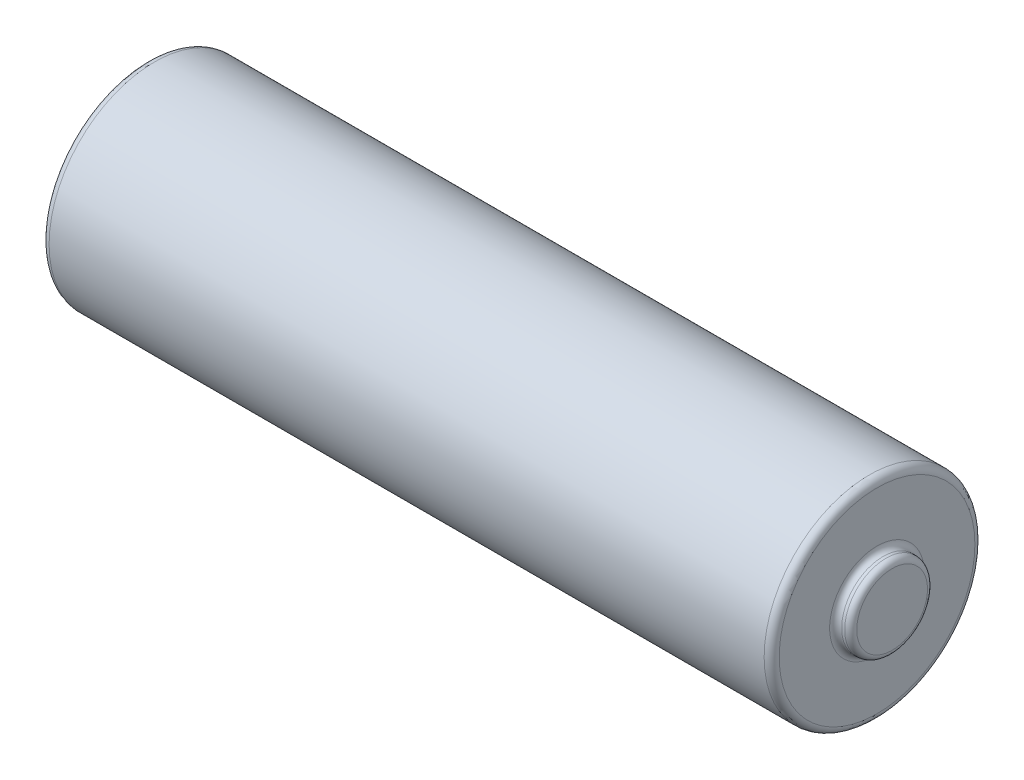
ISO-10303-21;
HEADER;
FILE_DESCRIPTION(('STEP AP214'),'2;1');
FILE_NAME('part.step','',(''),(''),'','','');
FILE_SCHEMA(('AUTOMOTIVE_DESIGN { 1 0 10303 214 1 1 1 1 }'));
ENDSEC;
DATA;
#1=APPLICATION_CONTEXT('core data for automotive mechanical design processes');
#2=APPLICATION_PROTOCOL_DEFINITION('international standard','automotive_design',2000,#1);
#3=PRODUCT_CONTEXT('',#1,'mechanical');
#4=PRODUCT('Part','Part','',(#3));
#5=PRODUCT_RELATED_PRODUCT_CATEGORY('part','',(#4));
#6=PRODUCT_DEFINITION_FORMATION('','',#4);
#7=PRODUCT_DEFINITION_CONTEXT('part definition',#1,'design');
#8=PRODUCT_DEFINITION('design','',#6,#7);
#9=PRODUCT_DEFINITION_SHAPE('','',#8);
#10=(LENGTH_UNIT() NAMED_UNIT(*) SI_UNIT(.MILLI.,.METRE.));
#11=(NAMED_UNIT(*) PLANE_ANGLE_UNIT() SI_UNIT($,.RADIAN.));
#12=(NAMED_UNIT(*) SI_UNIT($,.STERADIAN.) SOLID_ANGLE_UNIT());
#13=UNCERTAINTY_MEASURE_WITH_UNIT(LENGTH_MEASURE(1.E-05),#10,'distance_accuracy_value','');
#14=(GEOMETRIC_REPRESENTATION_CONTEXT(3) GLOBAL_UNCERTAINTY_ASSIGNED_CONTEXT((#13)) GLOBAL_UNIT_ASSIGNED_CONTEXT((#10,
#11,#12)) REPRESENTATION_CONTEXT('',''));
#15=CARTESIAN_POINT('',(0.,0.,0.));
#16=DIRECTION('',(0.,0.,1.));
#17=DIRECTION('',(1.,0.,0.));
#18=AXIS2_PLACEMENT_3D('',#15,#16,#17);
#19=CARTESIAN_POINT('',(92.5,-9.869,8.1));
#20=DIRECTION('',(-1.,0.,0.));
#21=DIRECTION('',(0.,0.,1.));
#22=AXIS2_PLACEMENT_3D('',#19,#20,#21);
#23=CYLINDRICAL_SURFACE('',#22,7.);
#24=CARTESIAN_POINT('',(92.,-9.869,8.1));
#25=DIRECTION('',(1.,0.,0.));
#26=DIRECTION('',(0.,0.,-1.));
#27=AXIS2_PLACEMENT_3D('',#24,#25,#26);
#28=CIRCLE('',#27,7.);
#29=CARTESIAN_POINT('',(92.,-9.869,15.1));
#30=VERTEX_POINT('',#29);
#31=EDGE_CURVE('E92',#30,#30,#28,.F.);
#32=CARTESIAN_POINT('',(44.5,-9.869,8.1));
#33=DIRECTION('',(1.,0.,0.));
#34=DIRECTION('',(0.,0.,-1.));
#35=AXIS2_PLACEMENT_3D('',#32,#33,#34);
#36=CIRCLE('',#35,7.);
#37=CARTESIAN_POINT('',(44.5,-9.869,15.1));
#38=VERTEX_POINT('',#37);
#39=EDGE_CURVE('E96',#38,#38,#36,.T.);
#40=CARTESIAN_POINT('',(92.,-9.869,15.1));
#41=CARTESIAN_POINT('',(91.5052083333333,-9.869,15.1));
#42=CARTESIAN_POINT('',(91.0104166666666,-9.869,15.1));
#43=CARTESIAN_POINT('',(90.0208333333333,-9.869,15.1));
#44=CARTESIAN_POINT('',(89.5260416666667,-9.869,15.1));
#45=CARTESIAN_POINT('',(88.5364583333333,-9.869,15.1));
#46=CARTESIAN_POINT('',(88.0416666666667,-9.869,15.1));
#47=CARTESIAN_POINT('',(87.0520833333333,-9.869,15.1));
#48=CARTESIAN_POINT('',(86.5572916666667,-9.869,15.1));
#49=CARTESIAN_POINT('',(85.5677083333333,-9.869,15.1));
#50=CARTESIAN_POINT('',(85.0729166666667,-9.869,15.1));
#51=CARTESIAN_POINT('',(84.0833333333333,-9.869,15.1));
#52=CARTESIAN_POINT('',(83.5885416666667,-9.869,15.1));
#53=CARTESIAN_POINT('',(82.5989583333333,-9.869,15.1));
#54=CARTESIAN_POINT('',(82.1041666666667,-9.869,15.1));
#55=CARTESIAN_POINT('',(81.1145833333333,-9.869,15.1));
#56=CARTESIAN_POINT('',(80.6197916666666,-9.869,15.1));
#57=CARTESIAN_POINT('',(79.6302083333333,-9.869,15.1));
#58=CARTESIAN_POINT('',(79.1354166666667,-9.869,15.1));
#59=CARTESIAN_POINT('',(78.1458333333333,-9.869,15.1));
#60=CARTESIAN_POINT('',(77.6510416666667,-9.869,15.1));
#61=CARTESIAN_POINT('',(76.6614583333333,-9.869,15.1));
#62=CARTESIAN_POINT('',(76.1666666666667,-9.869,15.1));
#63=CARTESIAN_POINT('',(75.1770833333333,-9.869,15.1));
#64=CARTESIAN_POINT('',(74.6822916666667,-9.869,15.1));
#65=CARTESIAN_POINT('',(73.6927083333333,-9.869,15.1));
#66=CARTESIAN_POINT('',(73.1979166666667,-9.869,15.1));
#67=CARTESIAN_POINT('',(72.2083333333333,-9.869,15.1));
#68=CARTESIAN_POINT('',(71.7135416666667,-9.869,15.1));
#69=CARTESIAN_POINT('',(70.7239583333333,-9.869,15.1));
#70=CARTESIAN_POINT('',(70.2291666666667,-9.869,15.1));
#71=CARTESIAN_POINT('',(69.2395833333333,-9.869,15.1));
#72=CARTESIAN_POINT('',(68.7447916666667,-9.869,15.1));
#73=CARTESIAN_POINT('',(67.7552083333333,-9.869,15.1));
#74=CARTESIAN_POINT('',(67.2604166666667,-9.869,15.1));
#75=CARTESIAN_POINT('',(66.2708333333333,-9.869,15.1));
#76=CARTESIAN_POINT('',(65.7760416666667,-9.869,15.1));
#77=CARTESIAN_POINT('',(64.7864583333333,-9.869,15.1));
#78=CARTESIAN_POINT('',(64.2916666666666,-9.869,15.1));
#79=CARTESIAN_POINT('',(63.3020833333333,-9.869,15.1));
#80=CARTESIAN_POINT('',(62.8072916666667,-9.869,15.1));
#81=CARTESIAN_POINT('',(61.8177083333333,-9.869,15.1));
#82=CARTESIAN_POINT('',(61.3229166666667,-9.869,15.1));
#83=CARTESIAN_POINT('',(60.3333333333333,-9.869,15.1));
#84=CARTESIAN_POINT('',(59.8385416666667,-9.869,15.1));
#85=CARTESIAN_POINT('',(58.8489583333333,-9.869,15.1));
#86=CARTESIAN_POINT('',(58.3541666666667,-9.869,15.1));
#87=CARTESIAN_POINT('',(57.3645833333333,-9.869,15.1));
#88=CARTESIAN_POINT('',(56.8697916666667,-9.869,15.1));
#89=CARTESIAN_POINT('',(55.8802083333333,-9.869,15.1));
#90=CARTESIAN_POINT('',(55.3854166666667,-9.869,15.1));
#91=CARTESIAN_POINT('',(54.3958333333333,-9.869,15.1));
#92=CARTESIAN_POINT('',(53.9010416666667,-9.869,15.1));
#93=CARTESIAN_POINT('',(52.9114583333333,-9.869,15.1));
#94=CARTESIAN_POINT('',(52.4166666666667,-9.869,15.1));
#95=CARTESIAN_POINT('',(51.4270833333333,-9.869,15.1));
#96=CARTESIAN_POINT('',(50.9322916666667,-9.869,15.1));
#97=CARTESIAN_POINT('',(49.9427083333333,-9.869,15.1));
#98=CARTESIAN_POINT('',(49.4479166666667,-9.869,15.1));
#99=CARTESIAN_POINT('',(48.4583333333333,-9.869,15.1));
#100=CARTESIAN_POINT('',(47.9635416666667,-9.869,15.1));
#101=CARTESIAN_POINT('',(46.9739583333333,-9.869,15.1));
#102=CARTESIAN_POINT('',(46.4791666666667,-9.869,15.1));
#103=CARTESIAN_POINT('',(45.4895833333333,-9.869,15.1));
#104=CARTESIAN_POINT('',(44.9947916666667,-9.869,15.1));
#105=CARTESIAN_POINT('',(44.5,-9.869,15.1));
#106=B_SPLINE_CURVE_WITH_KNOTS('',3,(#40,#41,#42,#43,#44,#45,#46,#47,#48,#49,#50,#51,#52,#53,
#54,#55,#56,#57,#58,#59,#60,#61,#62,#63,#64,#65,#66,#67,#68,#69,#70,#71,#72,#73,#74,#75,#76,#77,
#78,#79,#80,#81,#82,#83,#84,#85,#86,#87,#88,#89,#90,#91,#92,#93,#94,#95,#96,#97,#98,#99,#100,
#101,#102,#103,#104,#105),.UNSPECIFIED.,.F.,.F.,(4,2,2,2,2,2,2,2,2,2,2,2,2,2,2,2,2,2,2,2,2,2,2,
2,2,2,2,2,2,2,2,2,4),(0.,1.484375,2.96874999999999,4.45312499999999,5.9375,7.42187499999999,
8.90624999999999,10.390625,11.875,13.359375,14.84375,16.328125,17.8125,19.296875,20.78125,
22.265625,23.75,25.234375,26.71875,28.203125,29.6875,31.171875,32.65625,34.140625,35.625,
37.109375,38.59375,40.078125,41.5625,43.046875,44.53125,46.015625,47.5),.UNSPECIFIED.);
#107=EDGE_CURVE('BSEAM48',#30,#38,#106,.T.);
#108=ORIENTED_EDGE('',*,*,#31,.T.);
#109=ORIENTED_EDGE('',*,*,#39,.T.);
#110=ORIENTED_EDGE('',*,*,#107,.T.);
#111=ORIENTED_EDGE('',*,*,#107,.F.);
#112=EDGE_LOOP('',(#108,#110,#109,#111));
#113=FACE_BOUND('',#112,.T.);
#114=ADVANCED_FACE('F48',(#113),#23,.T.);
#115=CARTESIAN_POINT('',(92.5,-9.869,8.1));
#116=DIRECTION('',(1.,0.,0.));
#117=DIRECTION('',(0.,0.,-1.));
#118=AXIS2_PLACEMENT_3D('',#115,#116,#117);
#119=PLANE('',#118);
#120=CARTESIAN_POINT('',(92.5,-9.869,8.1));
#121=DIRECTION('',(1.,0.,0.));
#122=DIRECTION('',(0.,0.,-1.));
#123=AXIS2_PLACEMENT_3D('',#120,#121,#122);
#124=CIRCLE('',#123,3.15);
#125=CARTESIAN_POINT('',(92.5,-9.869,4.95));
#126=VERTEX_POINT('',#125);
#127=EDGE_CURVE('E76',#126,#126,#124,.F.);
#128=ORIENTED_EDGE('',*,*,#127,.T.);
#129=EDGE_LOOP('',(#128));
#130=FACE_BOUND('',#129,.T.);
#131=CARTESIAN_POINT('',(92.5,-9.869,8.1));
#132=DIRECTION('',(1.,0.,0.));
#133=DIRECTION('',(0.,0.,-1.));
#134=AXIS2_PLACEMENT_3D('',#131,#132,#133);
#135=CIRCLE('',#134,6.5);
#136=CARTESIAN_POINT('',(92.5,-9.869,1.6));
#137=VERTEX_POINT('',#136);
#138=EDGE_CURVE('E100',#137,#137,#135,.T.);
#139=ORIENTED_EDGE('',*,*,#138,.T.);
#140=EDGE_LOOP('',(#139));
#141=FACE_BOUND('',#140,.T.);
#142=ADVANCED_FACE('F105',(#130,#141),#119,.T.);
#143=CARTESIAN_POINT('',(44.,-9.869,8.1));
#144=DIRECTION('',(1.,0.,0.));
#145=DIRECTION('',(0.,0.,-1.));
#146=AXIS2_PLACEMENT_3D('',#143,#144,#145);
#147=PLANE('',#146);
#148=CARTESIAN_POINT('',(44.,-9.869,8.1));
#149=DIRECTION('',(1.,0.,0.));
#150=DIRECTION('',(0.,0.,-1.));
#151=AXIS2_PLACEMENT_3D('',#148,#149,#150);
#152=CIRCLE('',#151,4.65);
#153=CARTESIAN_POINT('',(44.,-9.869,3.45));
#154=VERTEX_POINT('',#153);
#155=EDGE_CURVE('E56',#154,#154,#152,.T.);
#156=ORIENTED_EDGE('',*,*,#155,.T.);
#157=EDGE_LOOP('',(#156));
#158=FACE_BOUND('',#157,.T.);
#159=CARTESIAN_POINT('',(44.,-9.869,8.1));
#160=DIRECTION('',(1.,0.,0.));
#161=DIRECTION('',(0.,0.,-1.));
#162=AXIS2_PLACEMENT_3D('',#159,#160,#161);
#163=CIRCLE('',#162,6.5);
#164=CARTESIAN_POINT('',(44.,-9.869,1.6));
#165=VERTEX_POINT('',#164);
#166=EDGE_CURVE('E88',#165,#165,#163,.F.);
#167=ORIENTED_EDGE('',*,*,#166,.T.);
#168=EDGE_LOOP('',(#167));
#169=FACE_BOUND('',#168,.T.);
#170=ADVANCED_FACE('F129',(#158,#169),#147,.F.);
#171=CARTESIAN_POINT('',(93.5,-9.869,8.1));
#172=DIRECTION('',(-1.,0.,0.));
#173=DIRECTION('',(0.,0.,1.));
#174=AXIS2_PLACEMENT_3D('',#171,#172,#173);
#175=CYLINDRICAL_SURFACE('',#174,2.75);
#176=CARTESIAN_POINT('',(92.9,-9.869,8.1));
#177=DIRECTION('',(1.,0.,0.));
#178=DIRECTION('',(0.,0.,-1.));
#179=AXIS2_PLACEMENT_3D('',#176,#177,#178);
#180=CIRCLE('',#179,2.75);
#181=CARTESIAN_POINT('',(92.9,-9.869,5.35));
#182=VERTEX_POINT('',#181);
#183=EDGE_CURVE('E80',#182,#182,#180,.T.);
#184=ORIENTED_EDGE('',*,*,#183,.T.);
#185=EDGE_LOOP('',(#184));
#186=FACE_BOUND('',#185,.T.);
#187=CARTESIAN_POINT('',(93.1,-9.869,8.1));
#188=DIRECTION('',(1.,0.,0.));
#189=DIRECTION('',(0.,0.,-1.));
#190=AXIS2_PLACEMENT_3D('',#187,#188,#189);
#191=CIRCLE('',#190,2.75);
#192=CARTESIAN_POINT('',(93.1,-9.869,5.35));
#193=VERTEX_POINT('',#192);
#194=EDGE_CURVE('E84',#193,#193,#191,.F.);
#195=ORIENTED_EDGE('',*,*,#194,.T.);
#196=EDGE_LOOP('',(#195));
#197=FACE_BOUND('',#196,.T.);
#198=ADVANCED_FACE('F135',(#186,#197),#175,.T.);
#199=CARTESIAN_POINT('',(93.5,-9.869,8.1));
#200=DIRECTION('',(1.,0.,0.));
#201=DIRECTION('',(0.,0.,-1.));
#202=AXIS2_PLACEMENT_3D('',#199,#200,#201);
#203=PLANE('',#202);
#204=CARTESIAN_POINT('',(93.5,-9.869,8.1));
#205=DIRECTION('',(1.,0.,0.));
#206=DIRECTION('',(0.,0.,-1.));
#207=AXIS2_PLACEMENT_3D('',#204,#205,#206);
#208=CIRCLE('',#207,2.35);
#209=CARTESIAN_POINT('',(93.5,-9.869,5.75));
#210=VERTEX_POINT('',#209);
#211=EDGE_CURVE('E72',#210,#210,#208,.T.);
#212=ORIENTED_EDGE('',*,*,#211,.T.);
#213=EDGE_LOOP('',(#212));
#214=FACE_BOUND('',#213,.T.);
#215=ADVANCED_FACE('F139',(#214),#203,.T.);
#216=CARTESIAN_POINT('',(43.,-9.869,8.1));
#217=DIRECTION('',(1.,0.,0.));
#218=DIRECTION('',(0.,0.,-1.));
#219=AXIS2_PLACEMENT_3D('',#216,#217,#218);
#220=CYLINDRICAL_SURFACE('',#219,4.25);
#221=CARTESIAN_POINT('',(43.6,-9.869,8.1));
#222=DIRECTION('',(1.,0.,0.));
#223=DIRECTION('',(0.,0.,-1.));
#224=AXIS2_PLACEMENT_3D('',#221,#222,#223);
#225=CIRCLE('',#224,4.25);
#226=CARTESIAN_POINT('',(43.6,-9.869,3.85));
#227=VERTEX_POINT('',#226);
#228=EDGE_CURVE('E61',#227,#227,#225,.F.);
#229=ORIENTED_EDGE('',*,*,#228,.T.);
#230=EDGE_LOOP('',(#229));
#231=FACE_BOUND('',#230,.T.);
#232=CARTESIAN_POINT('',(43.4,-9.869,8.1));
#233=DIRECTION('',(-1.,0.,0.));
#234=DIRECTION('',(0.,0.,1.));
#235=AXIS2_PLACEMENT_3D('',#232,#233,#234);
#236=CIRCLE('',#235,4.25);
#237=CARTESIAN_POINT('',(43.4,-9.869,12.35));
#238=VERTEX_POINT('',#237);
#239=EDGE_CURVE('E66',#238,#238,#236,.F.);
#240=ORIENTED_EDGE('',*,*,#239,.T.);
#241=EDGE_LOOP('',(#240));
#242=FACE_BOUND('',#241,.T.);
#243=ADVANCED_FACE('F121',(#231,#242),#220,.T.);
#244=CARTESIAN_POINT('',(43.,-9.869,8.1));
#245=DIRECTION('',(-1.,0.,0.));
#246=DIRECTION('',(0.,0.,1.));
#247=AXIS2_PLACEMENT_3D('',#244,#245,#246);
#248=PLANE('',#247);
#249=CARTESIAN_POINT('',(43.,-9.869,8.1));
#250=DIRECTION('',(-1.,0.,0.));
#251=DIRECTION('',(0.,0.,1.));
#252=AXIS2_PLACEMENT_3D('',#249,#250,#251);
#253=CIRCLE('',#252,3.85);
#254=CARTESIAN_POINT('',(43.,-9.869,11.95));
#255=VERTEX_POINT('',#254);
#256=EDGE_CURVE('E10',#255,#255,#253,.T.);
#257=ORIENTED_EDGE('',*,*,#256,.T.);
#258=EDGE_LOOP('',(#257));
#259=FACE_BOUND('',#258,.T.);
#260=ADVANCED_FACE('F110',(#259),#248,.T.);
#261=CARTESIAN_POINT('',(92.,-9.869,8.1));
#262=DIRECTION('',(1.,0.,0.));
#263=DIRECTION('',(0.,0.,-1.));
#264=AXIS2_PLACEMENT_3D('',#261,#262,#263);
#265=TOROIDAL_SURFACE('',#264,6.5,0.5);
#266=ORIENTED_EDGE('',*,*,#31,.F.);
#267=EDGE_LOOP('',(#266));
#268=FACE_BOUND('',#267,.T.);
#269=ORIENTED_EDGE('',*,*,#138,.F.);
#270=EDGE_LOOP('',(#269));
#271=FACE_BOUND('',#270,.T.);
#272=ADVANCED_FACE('F107',(#268,#271),#265,.T.);
#273=CARTESIAN_POINT('',(44.5,-9.869,8.1));
#274=DIRECTION('',(1.,0.,0.));
#275=DIRECTION('',(0.,0.,-1.));
#276=AXIS2_PLACEMENT_3D('',#273,#274,#275);
#277=TOROIDAL_SURFACE('',#276,6.5,0.5);
#278=ORIENTED_EDGE('',*,*,#166,.F.);
#279=EDGE_LOOP('',(#278));
#280=FACE_BOUND('',#279,.T.);
#281=ORIENTED_EDGE('',*,*,#39,.F.);
#282=EDGE_LOOP('',(#281));
#283=FACE_BOUND('',#282,.T.);
#284=ADVANCED_FACE('F109',(#280,#283),#277,.T.);
#285=CARTESIAN_POINT('',(92.9,-9.869,8.1));
#286=DIRECTION('',(1.,0.,0.));
#287=DIRECTION('',(0.,0.,-1.));
#288=AXIS2_PLACEMENT_3D('',#285,#286,#287);
#289=TOROIDAL_SURFACE('',#288,3.15,0.4);
#290=ORIENTED_EDGE('',*,*,#127,.F.);
#291=EDGE_LOOP('',(#290));
#292=FACE_BOUND('',#291,.T.);
#293=ORIENTED_EDGE('',*,*,#183,.F.);
#294=EDGE_LOOP('',(#293));
#295=FACE_BOUND('',#294,.T.);
#296=ADVANCED_FACE('F117',(#292,#295),#289,.F.);
#297=CARTESIAN_POINT('',(93.1,-9.869,8.1));
#298=DIRECTION('',(1.,0.,0.));
#299=DIRECTION('',(0.,0.,-1.));
#300=AXIS2_PLACEMENT_3D('',#297,#298,#299);
#301=TOROIDAL_SURFACE('',#300,2.35,0.4);
#302=ORIENTED_EDGE('',*,*,#194,.F.);
#303=EDGE_LOOP('',(#302));
#304=FACE_BOUND('',#303,.T.);
#305=ORIENTED_EDGE('',*,*,#211,.F.);
#306=EDGE_LOOP('',(#305));
#307=FACE_BOUND('',#306,.T.);
#308=ADVANCED_FACE('F158',(#304,#307),#301,.T.);
#309=CARTESIAN_POINT('',(43.6,-9.869,8.1));
#310=DIRECTION('',(1.,0.,0.));
#311=DIRECTION('',(0.,0.,-1.));
#312=AXIS2_PLACEMENT_3D('',#309,#310,#311);
#313=TOROIDAL_SURFACE('',#312,4.65,0.4);
#314=ORIENTED_EDGE('',*,*,#155,.F.);
#315=EDGE_LOOP('',(#314));
#316=FACE_BOUND('',#315,.T.);
#317=ORIENTED_EDGE('',*,*,#228,.F.);
#318=EDGE_LOOP('',(#317));
#319=FACE_BOUND('',#318,.T.);
#320=ADVANCED_FACE('F154',(#316,#319),#313,.F.);
#321=CARTESIAN_POINT('',(43.4,-9.869,8.1));
#322=DIRECTION('',(-1.,0.,0.));
#323=DIRECTION('',(0.,0.,1.));
#324=AXIS2_PLACEMENT_3D('',#321,#322,#323);
#325=TOROIDAL_SURFACE('',#324,3.85,0.4);
#326=ORIENTED_EDGE('',*,*,#239,.F.);
#327=EDGE_LOOP('',(#326));
#328=FACE_BOUND('',#327,.T.);
#329=ORIENTED_EDGE('',*,*,#256,.F.);
#330=EDGE_LOOP('',(#329));
#331=FACE_BOUND('',#330,.T.);
#332=ADVANCED_FACE('F50',(#328,#331),#325,.T.);
#333=CLOSED_SHELL('',(#114,#142,#170,#198,#215,#243,#260,#272,#284,#296,#308,#320,#332));
#334=MANIFOLD_SOLID_BREP('B2',#333);
#335=ADVANCED_BREP_SHAPE_REPRESENTATION('',(#18,#334),#14);
#336=SHAPE_DEFINITION_REPRESENTATION(#9,#335);
ENDSEC;
END-ISO-10303-21;
